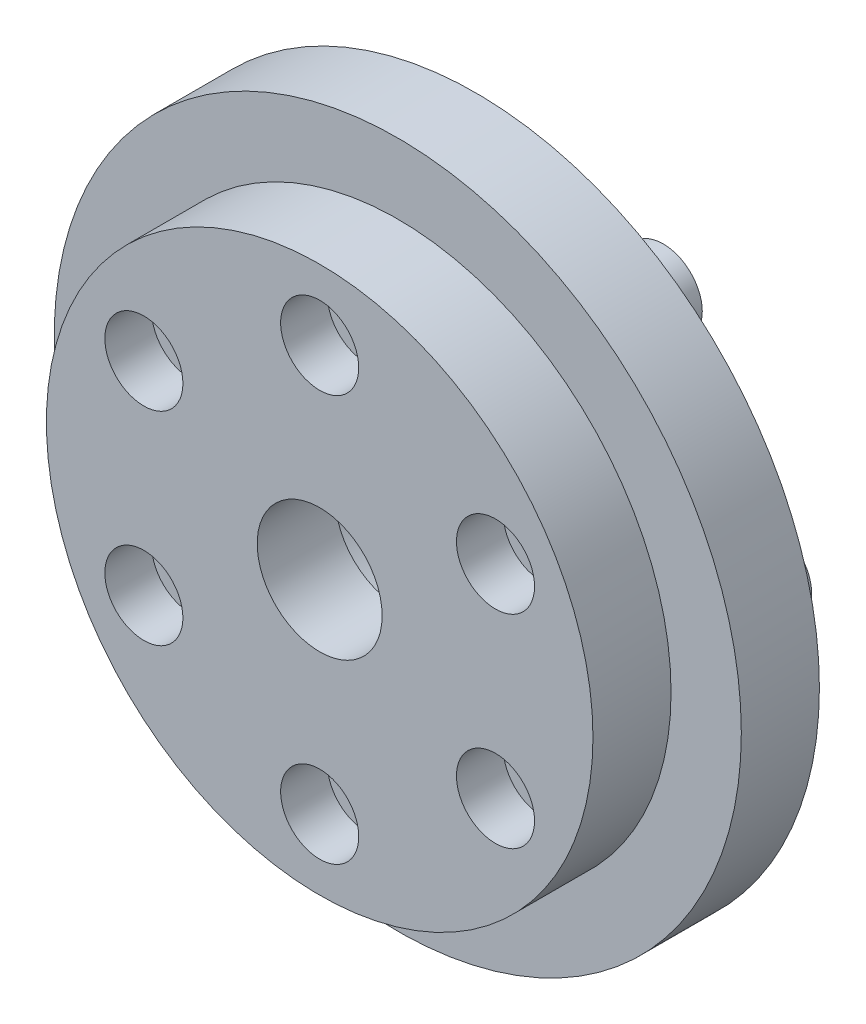
ISO-10303-21;
HEADER;
FILE_DESCRIPTION(('STEP AP214'),'2;1');
FILE_NAME('part.step','',(''),(''),'','','');
FILE_SCHEMA(('AUTOMOTIVE_DESIGN { 1 0 10303 214 1 1 1 1 }'));
ENDSEC;
DATA;
#1=APPLICATION_CONTEXT('core data for automotive mechanical design processes');
#2=APPLICATION_PROTOCOL_DEFINITION('international standard','automotive_design',2000,#1);
#3=PRODUCT_CONTEXT('',#1,'mechanical');
#4=PRODUCT('Part','Part','',(#3));
#5=PRODUCT_RELATED_PRODUCT_CATEGORY('part','',(#4));
#6=PRODUCT_DEFINITION_FORMATION('','',#4);
#7=PRODUCT_DEFINITION_CONTEXT('part definition',#1,'design');
#8=PRODUCT_DEFINITION('design','',#6,#7);
#9=PRODUCT_DEFINITION_SHAPE('','',#8);
#10=(LENGTH_UNIT() NAMED_UNIT(*) SI_UNIT(.MILLI.,.METRE.));
#11=(NAMED_UNIT(*) PLANE_ANGLE_UNIT() SI_UNIT($,.RADIAN.));
#12=(NAMED_UNIT(*) SI_UNIT($,.STERADIAN.) SOLID_ANGLE_UNIT());
#13=UNCERTAINTY_MEASURE_WITH_UNIT(LENGTH_MEASURE(1.E-05),#10,'distance_accuracy_value','');
#14=(GEOMETRIC_REPRESENTATION_CONTEXT(3) GLOBAL_UNCERTAINTY_ASSIGNED_CONTEXT((#13)) GLOBAL_UNIT_ASSIGNED_CONTEXT((#10,
#11,#12)) REPRESENTATION_CONTEXT('',''));
#15=CARTESIAN_POINT('',(0.,0.,0.));
#16=DIRECTION('',(0.,0.,1.));
#17=DIRECTION('',(1.,0.,0.));
#18=AXIS2_PLACEMENT_3D('',#15,#16,#17);
#19=CARTESIAN_POINT('',(0.,0.,-17.6274169979695));
#20=DIRECTION('',(0.,0.,1.));
#21=DIRECTION('',(1.,0.,0.));
#22=AXIS2_PLACEMENT_3D('',#19,#20,#21);
#23=CYLINDRICAL_SURFACE('',#22,8.);
#24=CARTESIAN_POINT('',(0.,0.,5.));
#25=DIRECTION('',(0.,0.,1.));
#26=DIRECTION('',(1.,0.,0.));
#27=AXIS2_PLACEMENT_3D('',#24,#25,#26);
#28=CIRCLE('',#27,8.);
#29=CARTESIAN_POINT('',(8.,0.,5.));
#30=VERTEX_POINT('',#29);
#31=EDGE_CURVE('E510',#30,#30,#28,.F.);
#32=ORIENTED_EDGE('',*,*,#31,.T.);
#33=EDGE_LOOP('',(#32));
#34=FACE_BOUND('',#33,.T.);
#35=CARTESIAN_POINT('',(0.,0.,10.));
#36=DIRECTION('',(0.,0.,1.));
#37=DIRECTION('',(1.,0.,0.));
#38=AXIS2_PLACEMENT_3D('',#35,#36,#37);
#39=CIRCLE('',#38,8.);
#40=CARTESIAN_POINT('',(8.,0.,10.));
#41=VERTEX_POINT('',#40);
#42=EDGE_CURVE('E10',#41,#41,#39,.F.);
#43=ORIENTED_EDGE('',*,*,#42,.F.);
#44=EDGE_LOOP('',(#43));
#45=FACE_BOUND('',#44,.T.);
#46=ADVANCED_FACE('F35',(#34,#45),#23,.F.);
#47=CARTESIAN_POINT('',(-7.,12.1243556529821,5.));
#48=DIRECTION('',(0.,0.,-1.));
#49=DIRECTION('',(-1.,0.,0.));
#50=AXIS2_PLACEMENT_3D('',#47,#48,#49);
#51=CYLINDRICAL_SURFACE('',#50,2.5);
#52=CARTESIAN_POINT('',(-7.,12.1243556529821,5.));
#53=DIRECTION('',(0.,0.,1.));
#54=DIRECTION('',(1.,0.,0.));
#55=AXIS2_PLACEMENT_3D('',#52,#53,#54);
#56=CIRCLE('',#55,2.5);
#57=CARTESIAN_POINT('',(-4.5,12.1243556529821,5.));
#58=VERTEX_POINT('',#57);
#59=EDGE_CURVE('E78',#58,#58,#56,.T.);
#60=ORIENTED_EDGE('',*,*,#59,.F.);
#61=EDGE_LOOP('',(#60));
#62=FACE_BOUND('',#61,.T.);
#63=CARTESIAN_POINT('',(-7.,12.1243556529821,0.));
#64=DIRECTION('',(0.,0.,1.));
#65=DIRECTION('',(1.,0.,0.));
#66=AXIS2_PLACEMENT_3D('',#63,#64,#65);
#67=CIRCLE('',#66,2.5);
#68=CARTESIAN_POINT('',(-4.5,12.1243556529821,0.));
#69=VERTEX_POINT('',#68);
#70=EDGE_CURVE('E75',#69,#69,#67,.T.);
#71=ORIENTED_EDGE('',*,*,#70,.T.);
#72=EDGE_LOOP('',(#71));
#73=FACE_BOUND('',#72,.T.);
#74=ADVANCED_FACE('F37',(#62,#73),#51,.T.);
#75=CARTESIAN_POINT('',(-7.,12.1243556529821,0.));
#76=DIRECTION('',(0.,0.,1.));
#77=DIRECTION('',(1.,0.,0.));
#78=AXIS2_PLACEMENT_3D('',#75,#76,#77);
#79=PLANE('',#78);
#80=ORIENTED_EDGE('',*,*,#70,.F.);
#81=EDGE_LOOP('',(#80));
#82=FACE_BOUND('',#81,.T.);
#83=ADVANCED_FACE('F117',(#82),#79,.F.);
#84=CARTESIAN_POINT('',(0.,0.,10.));
#85=DIRECTION('',(0.,0.,-1.));
#86=DIRECTION('',(-1.,0.,0.));
#87=AXIS2_PLACEMENT_3D('',#84,#85,#86);
#88=CYLINDRICAL_SURFACE('',#87,22.);
#89=CARTESIAN_POINT('',(0.,0.,10.));
#90=DIRECTION('',(0.,0.,1.));
#91=DIRECTION('',(1.,0.,0.));
#92=AXIS2_PLACEMENT_3D('',#89,#90,#91);
#93=CIRCLE('',#92,22.);
#94=CARTESIAN_POINT('',(22.,0.,10.));
#95=VERTEX_POINT('',#94);
#96=EDGE_CURVE('E72',#95,#95,#93,.T.);
#97=ORIENTED_EDGE('',*,*,#96,.F.);
#98=EDGE_LOOP('',(#97));
#99=FACE_BOUND('',#98,.T.);
#100=CARTESIAN_POINT('',(0.,0.,5.));
#101=DIRECTION('',(0.,0.,1.));
#102=DIRECTION('',(1.,0.,0.));
#103=AXIS2_PLACEMENT_3D('',#100,#101,#102);
#104=CIRCLE('',#103,22.);
#105=CARTESIAN_POINT('',(22.,0.,5.));
#106=VERTEX_POINT('',#105);
#107=EDGE_CURVE('E71',#106,#106,#104,.T.);
#108=ORIENTED_EDGE('',*,*,#107,.T.);
#109=EDGE_LOOP('',(#108));
#110=FACE_BOUND('',#109,.T.);
#111=ADVANCED_FACE('F115',(#99,#110),#88,.T.);
#112=CARTESIAN_POINT('',(0.,0.,10.));
#113=DIRECTION('',(0.,0.,1.));
#114=DIRECTION('',(1.,0.,0.));
#115=AXIS2_PLACEMENT_3D('',#112,#113,#114);
#116=PLANE('',#115);
#117=CARTESIAN_POINT('',(0.,0.,10.));
#118=DIRECTION('',(0.,0.,1.));
#119=DIRECTION('',(1.,0.,0.));
#120=AXIS2_PLACEMENT_3D('',#117,#118,#119);
#121=CIRCLE('',#120,17.5);
#122=CARTESIAN_POINT('',(17.5,0.,10.));
#123=VERTEX_POINT('',#122);
#124=EDGE_CURVE('E42',#123,#123,#121,.T.);
#125=ORIENTED_EDGE('',*,*,#124,.F.);
#126=EDGE_LOOP('',(#125));
#127=FACE_BOUND('',#126,.T.);
#128=ORIENTED_EDGE('',*,*,#96,.T.);
#129=EDGE_LOOP('',(#128));
#130=FACE_BOUND('',#129,.T.);
#131=ADVANCED_FACE('F102',(#127,#130),#116,.T.);
#132=CARTESIAN_POINT('',(0.,0.,5.));
#133=DIRECTION('',(0.,0.,1.));
#134=DIRECTION('',(1.,0.,0.));
#135=AXIS2_PLACEMENT_3D('',#132,#133,#134);
#136=PLANE('',#135);
#137=ORIENTED_EDGE('',*,*,#31,.F.);
#138=EDGE_LOOP('',(#137));
#139=FACE_BOUND('',#138,.T.);
#140=CARTESIAN_POINT('',(-14.,1.6826817716975E-13,5.));
#141=DIRECTION('',(0.,0.,1.));
#142=DIRECTION('',(1.,0.,0.));
#143=AXIS2_PLACEMENT_3D('',#140,#141,#142);
#144=CIRCLE('',#143,2.5);
#145=CARTESIAN_POINT('',(-11.5,1.6826817716975E-13,5.));
#146=VERTEX_POINT('',#145);
#147=EDGE_CURVE('E46',#146,#146,#144,.F.);
#148=ORIENTED_EDGE('',*,*,#147,.F.);
#149=EDGE_LOOP('',(#148));
#150=FACE_BOUND('',#149,.T.);
#151=CARTESIAN_POINT('',(-7.00000000000011,-12.1243556529821,5.));
#152=DIRECTION('',(0.,0.,1.));
#153=DIRECTION('',(1.,0.,0.));
#154=AXIS2_PLACEMENT_3D('',#151,#152,#153);
#155=CIRCLE('',#154,2.5);
#156=CARTESIAN_POINT('',(-4.50000000000011,-12.1243556529821,5.));
#157=VERTEX_POINT('',#156);
#158=EDGE_CURVE('E51',#157,#157,#155,.F.);
#159=ORIENTED_EDGE('',*,*,#158,.F.);
#160=EDGE_LOOP('',(#159));
#161=FACE_BOUND('',#160,.T.);
#162=CARTESIAN_POINT('',(6.99999999999991,-12.1243556529822,5.));
#163=DIRECTION('',(0.,0.,1.));
#164=DIRECTION('',(1.,0.,0.));
#165=AXIS2_PLACEMENT_3D('',#162,#163,#164);
#166=CIRCLE('',#165,2.5);
#167=CARTESIAN_POINT('',(9.49999999999991,-12.1243556529822,5.));
#168=VERTEX_POINT('',#167);
#169=EDGE_CURVE('E89',#168,#168,#166,.F.);
#170=ORIENTED_EDGE('',*,*,#169,.F.);
#171=EDGE_LOOP('',(#170));
#172=FACE_BOUND('',#171,.T.);
#173=CARTESIAN_POINT('',(14.,0.,5.));
#174=DIRECTION('',(0.,0.,1.));
#175=DIRECTION('',(1.,0.,0.));
#176=AXIS2_PLACEMENT_3D('',#173,#174,#175);
#177=CIRCLE('',#176,2.5);
#178=CARTESIAN_POINT('',(16.5,0.,5.));
#179=VERTEX_POINT('',#178);
#180=EDGE_CURVE('E86',#179,#179,#177,.F.);
#181=ORIENTED_EDGE('',*,*,#180,.F.);
#182=EDGE_LOOP('',(#181));
#183=FACE_BOUND('',#182,.T.);
#184=CARTESIAN_POINT('',(7.00000000000003,12.1243556529821,5.));
#185=DIRECTION('',(0.,0.,1.));
#186=DIRECTION('',(1.,0.,0.));
#187=AXIS2_PLACEMENT_3D('',#184,#185,#186);
#188=CIRCLE('',#187,2.5);
#189=CARTESIAN_POINT('',(9.50000000000003,12.1243556529821,5.));
#190=VERTEX_POINT('',#189);
#191=EDGE_CURVE('E81',#190,#190,#188,.F.);
#192=ORIENTED_EDGE('',*,*,#191,.F.);
#193=EDGE_LOOP('',(#192));
#194=FACE_BOUND('',#193,.T.);
#195=ORIENTED_EDGE('',*,*,#59,.T.);
#196=EDGE_LOOP('',(#195));
#197=FACE_BOUND('',#196,.T.);
#198=ORIENTED_EDGE('',*,*,#107,.F.);
#199=EDGE_LOOP('',(#198));
#200=FACE_BOUND('',#199,.T.);
#201=ADVANCED_FACE('F98',(#139,#150,#161,#172,#183,#194,#197,#200),#136,.F.);
#202=CARTESIAN_POINT('',(7.00000000000003,12.1243556529821,5.));
#203=DIRECTION('',(0.,0.,-1.));
#204=DIRECTION('',(-1.,0.,0.));
#205=AXIS2_PLACEMENT_3D('',#202,#203,#204);
#206=CYLINDRICAL_SURFACE('',#205,2.5);
#207=ORIENTED_EDGE('',*,*,#191,.T.);
#208=EDGE_LOOP('',(#207));
#209=FACE_BOUND('',#208,.T.);
#210=CARTESIAN_POINT('',(7.00000000000003,12.1243556529821,0.));
#211=DIRECTION('',(0.,0.,1.));
#212=DIRECTION('',(1.,0.,0.));
#213=AXIS2_PLACEMENT_3D('',#210,#211,#212);
#214=CIRCLE('',#213,2.5);
#215=CARTESIAN_POINT('',(9.50000000000003,12.1243556529821,0.));
#216=VERTEX_POINT('',#215);
#217=EDGE_CURVE('E68',#216,#216,#214,.T.);
#218=ORIENTED_EDGE('',*,*,#217,.T.);
#219=EDGE_LOOP('',(#218));
#220=FACE_BOUND('',#219,.T.);
#221=ADVANCED_FACE('F101',(#209,#220),#206,.T.);
#222=CARTESIAN_POINT('',(7.00000000000003,12.1243556529821,0.));
#223=DIRECTION('',(0.,0.,1.));
#224=DIRECTION('',(1.,0.,0.));
#225=AXIS2_PLACEMENT_3D('',#222,#223,#224);
#226=PLANE('',#225);
#227=ORIENTED_EDGE('',*,*,#217,.F.);
#228=EDGE_LOOP('',(#227));
#229=FACE_BOUND('',#228,.T.);
#230=ADVANCED_FACE('F176',(#229),#226,.F.);
#231=CARTESIAN_POINT('',(14.,0.,5.));
#232=DIRECTION('',(0.,0.,-1.));
#233=DIRECTION('',(-1.,0.,0.));
#234=AXIS2_PLACEMENT_3D('',#231,#232,#233);
#235=CYLINDRICAL_SURFACE('',#234,2.5);
#236=ORIENTED_EDGE('',*,*,#180,.T.);
#237=EDGE_LOOP('',(#236));
#238=FACE_BOUND('',#237,.T.);
#239=CARTESIAN_POINT('',(14.,0.,0.));
#240=DIRECTION('',(0.,0.,1.));
#241=DIRECTION('',(1.,0.,0.));
#242=AXIS2_PLACEMENT_3D('',#239,#240,#241);
#243=CIRCLE('',#242,2.5);
#244=CARTESIAN_POINT('',(16.5,0.,0.));
#245=VERTEX_POINT('',#244);
#246=EDGE_CURVE('E65',#245,#245,#243,.T.);
#247=ORIENTED_EDGE('',*,*,#246,.T.);
#248=EDGE_LOOP('',(#247));
#249=FACE_BOUND('',#248,.T.);
#250=ADVANCED_FACE('F173',(#238,#249),#235,.T.);
#251=CARTESIAN_POINT('',(14.,0.,0.));
#252=DIRECTION('',(0.,0.,1.));
#253=DIRECTION('',(1.,0.,0.));
#254=AXIS2_PLACEMENT_3D('',#251,#252,#253);
#255=PLANE('',#254);
#256=ORIENTED_EDGE('',*,*,#246,.F.);
#257=EDGE_LOOP('',(#256));
#258=FACE_BOUND('',#257,.T.);
#259=ADVANCED_FACE('F168',(#258),#255,.F.);
#260=CARTESIAN_POINT('',(6.99999999999991,-12.1243556529822,5.));
#261=DIRECTION('',(0.,0.,-1.));
#262=DIRECTION('',(-1.,0.,0.));
#263=AXIS2_PLACEMENT_3D('',#260,#261,#262);
#264=CYLINDRICAL_SURFACE('',#263,2.5);
#265=ORIENTED_EDGE('',*,*,#169,.T.);
#266=EDGE_LOOP('',(#265));
#267=FACE_BOUND('',#266,.T.);
#268=CARTESIAN_POINT('',(6.99999999999991,-12.1243556529822,0.));
#269=DIRECTION('',(0.,0.,1.));
#270=DIRECTION('',(1.,0.,0.));
#271=AXIS2_PLACEMENT_3D('',#268,#269,#270);
#272=CIRCLE('',#271,2.5);
#273=CARTESIAN_POINT('',(9.49999999999991,-12.1243556529822,0.));
#274=VERTEX_POINT('',#273);
#275=EDGE_CURVE('E62',#274,#274,#272,.T.);
#276=ORIENTED_EDGE('',*,*,#275,.T.);
#277=EDGE_LOOP('',(#276));
#278=FACE_BOUND('',#277,.T.);
#279=ADVANCED_FACE('F165',(#267,#278),#264,.T.);
#280=CARTESIAN_POINT('',(6.99999999999991,-12.1243556529822,0.));
#281=DIRECTION('',(0.,0.,1.));
#282=DIRECTION('',(1.,0.,0.));
#283=AXIS2_PLACEMENT_3D('',#280,#281,#282);
#284=PLANE('',#283);
#285=ORIENTED_EDGE('',*,*,#275,.F.);
#286=EDGE_LOOP('',(#285));
#287=FACE_BOUND('',#286,.T.);
#288=ADVANCED_FACE('F161',(#287),#284,.F.);
#289=CARTESIAN_POINT('',(-7.00000000000011,-12.1243556529821,5.));
#290=DIRECTION('',(0.,0.,-1.));
#291=DIRECTION('',(-1.,0.,0.));
#292=AXIS2_PLACEMENT_3D('',#289,#290,#291);
#293=CYLINDRICAL_SURFACE('',#292,2.5);
#294=ORIENTED_EDGE('',*,*,#158,.T.);
#295=EDGE_LOOP('',(#294));
#296=FACE_BOUND('',#295,.T.);
#297=CARTESIAN_POINT('',(-7.00000000000011,-12.1243556529821,0.));
#298=DIRECTION('',(0.,0.,1.));
#299=DIRECTION('',(1.,0.,0.));
#300=AXIS2_PLACEMENT_3D('',#297,#298,#299);
#301=CIRCLE('',#300,2.5);
#302=CARTESIAN_POINT('',(-4.50000000000011,-12.1243556529821,0.));
#303=VERTEX_POINT('',#302);
#304=EDGE_CURVE('E59',#303,#303,#301,.T.);
#305=ORIENTED_EDGE('',*,*,#304,.T.);
#306=EDGE_LOOP('',(#305));
#307=FACE_BOUND('',#306,.T.);
#308=ADVANCED_FACE('F95',(#296,#307),#293,.T.);
#309=CARTESIAN_POINT('',(-7.00000000000011,-12.1243556529821,0.));
#310=DIRECTION('',(0.,0.,1.));
#311=DIRECTION('',(1.,0.,0.));
#312=AXIS2_PLACEMENT_3D('',#309,#310,#311);
#313=PLANE('',#312);
#314=ORIENTED_EDGE('',*,*,#304,.F.);
#315=EDGE_LOOP('',(#314));
#316=FACE_BOUND('',#315,.T.);
#317=ADVANCED_FACE('F154',(#316),#313,.F.);
#318=CARTESIAN_POINT('',(-14.,1.6826817716975E-13,5.));
#319=DIRECTION('',(0.,0.,-1.));
#320=DIRECTION('',(-1.,0.,0.));
#321=AXIS2_PLACEMENT_3D('',#318,#319,#320);
#322=CYLINDRICAL_SURFACE('',#321,2.5);
#323=ORIENTED_EDGE('',*,*,#147,.T.);
#324=EDGE_LOOP('',(#323));
#325=FACE_BOUND('',#324,.T.);
#326=CARTESIAN_POINT('',(-14.,1.6826817716975E-13,0.));
#327=DIRECTION('',(0.,0.,1.));
#328=DIRECTION('',(1.,0.,0.));
#329=AXIS2_PLACEMENT_3D('',#326,#327,#328);
#330=CIRCLE('',#329,2.5);
#331=CARTESIAN_POINT('',(-11.5,1.6826817716975E-13,0.));
#332=VERTEX_POINT('',#331);
#333=EDGE_CURVE('E56',#332,#332,#330,.T.);
#334=ORIENTED_EDGE('',*,*,#333,.T.);
#335=EDGE_LOOP('',(#334));
#336=FACE_BOUND('',#335,.T.);
#337=ADVANCED_FACE('F151',(#325,#336),#322,.T.);
#338=CARTESIAN_POINT('',(-14.,1.6826817716975E-13,0.));
#339=DIRECTION('',(0.,0.,1.));
#340=DIRECTION('',(1.,0.,0.));
#341=AXIS2_PLACEMENT_3D('',#338,#339,#340);
#342=PLANE('',#341);
#343=ORIENTED_EDGE('',*,*,#333,.F.);
#344=EDGE_LOOP('',(#343));
#345=FACE_BOUND('',#344,.T.);
#346=ADVANCED_FACE('F149',(#345),#342,.F.);
#347=CARTESIAN_POINT('',(0.,0.,15.));
#348=DIRECTION('',(0.,0.,-1.));
#349=DIRECTION('',(-1.,0.,0.));
#350=AXIS2_PLACEMENT_3D('',#347,#348,#349);
#351=CYLINDRICAL_SURFACE('',#350,17.5);
#352=CARTESIAN_POINT('',(0.,0.,15.));
#353=DIRECTION('',(0.,0.,1.));
#354=DIRECTION('',(1.,0.,0.));
#355=AXIS2_PLACEMENT_3D('',#352,#353,#354);
#356=CIRCLE('',#355,17.5);
#357=CARTESIAN_POINT('',(17.5,0.,15.));
#358=VERTEX_POINT('',#357);
#359=EDGE_CURVE('E54',#358,#358,#356,.T.);
#360=ORIENTED_EDGE('',*,*,#359,.F.);
#361=EDGE_LOOP('',(#360));
#362=FACE_BOUND('',#361,.T.);
#363=ORIENTED_EDGE('',*,*,#124,.T.);
#364=EDGE_LOOP('',(#363));
#365=FACE_BOUND('',#364,.T.);
#366=ADVANCED_FACE('F145',(#362,#365),#351,.T.);
#367=CARTESIAN_POINT('',(0.,0.,15.));
#368=DIRECTION('',(0.,0.,1.));
#369=DIRECTION('',(1.,0.,0.));
#370=AXIS2_PLACEMENT_3D('',#367,#368,#369);
#371=PLANE('',#370);
#372=CARTESIAN_POINT('',(0.,13.,15.));
#373=DIRECTION('',(0.,0.,1.));
#374=DIRECTION('',(1.,0.,0.));
#375=AXIS2_PLACEMENT_3D('',#372,#373,#374);
#376=CIRCLE('',#375,2.5);
#377=CARTESIAN_POINT('',(2.5,13.,15.));
#378=VERTEX_POINT('',#377);
#379=EDGE_CURVE('E511',#378,#378,#376,.T.);
#380=ORIENTED_EDGE('',*,*,#379,.F.);
#381=EDGE_LOOP('',(#380));
#382=FACE_BOUND('',#381,.T.);
#383=CARTESIAN_POINT('',(-11.2583302491976,6.50000000000013,15.));
#384=DIRECTION('',(0.,0.,1.));
#385=DIRECTION('',(1.,0.,0.));
#386=AXIS2_PLACEMENT_3D('',#383,#384,#385);
#387=CIRCLE('',#386,2.5);
#388=CARTESIAN_POINT('',(-8.75833024919763,6.50000000000013,15.));
#389=VERTEX_POINT('',#388);
#390=EDGE_CURVE('E515',#389,#389,#387,.T.);
#391=ORIENTED_EDGE('',*,*,#390,.F.);
#392=EDGE_LOOP('',(#391));
#393=FACE_BOUND('',#392,.T.);
#394=CARTESIAN_POINT('',(-11.2583302491978,-6.4999999999999,15.));
#395=DIRECTION('',(0.,0.,1.));
#396=DIRECTION('',(1.,0.,0.));
#397=AXIS2_PLACEMENT_3D('',#394,#395,#396);
#398=CIRCLE('',#397,2.5);
#399=CARTESIAN_POINT('',(-8.75833024919776,-6.4999999999999,15.));
#400=VERTEX_POINT('',#399);
#401=EDGE_CURVE('E538',#400,#400,#398,.T.);
#402=ORIENTED_EDGE('',*,*,#401,.F.);
#403=EDGE_LOOP('',(#402));
#404=FACE_BOUND('',#403,.T.);
#405=CARTESIAN_POINT('',(0.,-13.,15.));
#406=DIRECTION('',(0.,0.,1.));
#407=DIRECTION('',(1.,0.,0.));
#408=AXIS2_PLACEMENT_3D('',#405,#406,#407);
#409=CIRCLE('',#408,2.5);
#410=CARTESIAN_POINT('',(2.49999999999991,-13.,15.));
#411=VERTEX_POINT('',#410);
#412=EDGE_CURVE('E532',#411,#411,#409,.T.);
#413=ORIENTED_EDGE('',*,*,#412,.F.);
#414=EDGE_LOOP('',(#413));
#415=FACE_BOUND('',#414,.T.);
#416=CARTESIAN_POINT('',(11.2583302491977,-6.50000000000005,15.));
#417=DIRECTION('',(0.,0.,1.));
#418=DIRECTION('',(1.,0.,0.));
#419=AXIS2_PLACEMENT_3D('',#416,#417,#418);
#420=CIRCLE('',#419,2.5);
#421=CARTESIAN_POINT('',(13.7583302491977,-6.50000000000005,15.));
#422=VERTEX_POINT('',#421);
#423=EDGE_CURVE('E526',#422,#422,#420,.T.);
#424=ORIENTED_EDGE('',*,*,#423,.F.);
#425=EDGE_LOOP('',(#424));
#426=FACE_BOUND('',#425,.T.);
#427=CARTESIAN_POINT('',(11.2583302491977,6.49999999999997,15.));
#428=DIRECTION('',(0.,0.,1.));
#429=DIRECTION('',(1.,0.,0.));
#430=AXIS2_PLACEMENT_3D('',#427,#428,#429);
#431=CIRCLE('',#430,2.5);
#432=CARTESIAN_POINT('',(13.7583302491977,6.49999999999997,15.));
#433=VERTEX_POINT('',#432);
#434=EDGE_CURVE('E514',#433,#433,#431,.T.);
#435=ORIENTED_EDGE('',*,*,#434,.F.);
#436=EDGE_LOOP('',(#435));
#437=FACE_BOUND('',#436,.T.);
#438=ORIENTED_EDGE('',*,*,#359,.T.);
#439=EDGE_LOOP('',(#438));
#440=FACE_BOUND('',#439,.T.);
#441=CARTESIAN_POINT('',(0.,0.,15.));
#442=DIRECTION('',(0.,0.,1.));
#443=DIRECTION('',(1.,0.,0.));
#444=AXIS2_PLACEMENT_3D('',#441,#442,#443);
#445=CIRCLE('',#444,4.);
#446=CARTESIAN_POINT('',(4.,0.,15.));
#447=VERTEX_POINT('',#446);
#448=EDGE_CURVE('E501',#447,#447,#445,.T.);
#449=ORIENTED_EDGE('',*,*,#448,.F.);
#450=EDGE_LOOP('',(#449));
#451=FACE_BOUND('',#450,.T.);
#452=ADVANCED_FACE('F141',(#382,#393,#404,#415,#426,#437,#440,#451),#371,.T.);
#453=CARTESIAN_POINT('',(11.2583302491977,6.49999999999997,12.));
#454=DIRECTION('',(0.,0.,1.));
#455=DIRECTION('',(1.,0.,0.));
#456=AXIS2_PLACEMENT_3D('',#453,#454,#455);
#457=CYLINDRICAL_SURFACE('',#456,2.5);
#458=CARTESIAN_POINT('',(11.2583302491977,6.49999999999997,12.));
#459=DIRECTION('',(0.,0.,1.));
#460=DIRECTION('',(1.,0.,0.));
#461=AXIS2_PLACEMENT_3D('',#458,#459,#460);
#462=CIRCLE('',#461,2.5);
#463=CARTESIAN_POINT('',(13.7583302491977,6.49999999999997,12.));
#464=VERTEX_POINT('',#463);
#465=EDGE_CURVE('E523',#464,#464,#462,.T.);
#466=ORIENTED_EDGE('',*,*,#465,.F.);
#467=EDGE_LOOP('',(#466));
#468=FACE_BOUND('',#467,.T.);
#469=ORIENTED_EDGE('',*,*,#434,.T.);
#470=EDGE_LOOP('',(#469));
#471=FACE_BOUND('',#470,.T.);
#472=ADVANCED_FACE('F144',(#468,#471),#457,.F.);
#473=CARTESIAN_POINT('',(11.2583302491977,6.49999999999997,12.));
#474=DIRECTION('',(0.,0.,1.));
#475=DIRECTION('',(1.,0.,0.));
#476=AXIS2_PLACEMENT_3D('',#473,#474,#475);
#477=PLANE('',#476);
#478=ORIENTED_EDGE('',*,*,#465,.T.);
#479=EDGE_LOOP('',(#478));
#480=FACE_BOUND('',#479,.T.);
#481=ADVANCED_FACE('F241',(#480),#477,.T.);
#482=CARTESIAN_POINT('',(11.2583302491977,-6.50000000000005,12.));
#483=DIRECTION('',(0.,0.,1.));
#484=DIRECTION('',(1.,0.,0.));
#485=AXIS2_PLACEMENT_3D('',#482,#483,#484);
#486=CYLINDRICAL_SURFACE('',#485,2.5);
#487=CARTESIAN_POINT('',(11.2583302491977,-6.50000000000005,12.));
#488=DIRECTION('',(0.,0.,1.));
#489=DIRECTION('',(1.,0.,0.));
#490=AXIS2_PLACEMENT_3D('',#487,#488,#489);
#491=CIRCLE('',#490,2.5);
#492=CARTESIAN_POINT('',(13.7583302491977,-6.50000000000005,12.));
#493=VERTEX_POINT('',#492);
#494=EDGE_CURVE('E529',#493,#493,#491,.T.);
#495=ORIENTED_EDGE('',*,*,#494,.F.);
#496=EDGE_LOOP('',(#495));
#497=FACE_BOUND('',#496,.T.);
#498=ORIENTED_EDGE('',*,*,#423,.T.);
#499=EDGE_LOOP('',(#498));
#500=FACE_BOUND('',#499,.T.);
#501=ADVANCED_FACE('F249',(#497,#500),#486,.F.);
#502=CARTESIAN_POINT('',(11.2583302491977,-6.50000000000005,12.));
#503=DIRECTION('',(0.,0.,1.));
#504=DIRECTION('',(1.,0.,0.));
#505=AXIS2_PLACEMENT_3D('',#502,#503,#504);
#506=PLANE('',#505);
#507=ORIENTED_EDGE('',*,*,#494,.T.);
#508=EDGE_LOOP('',(#507));
#509=FACE_BOUND('',#508,.T.);
#510=ADVANCED_FACE('F257',(#509),#506,.T.);
#511=CARTESIAN_POINT('',(0.,-13.,12.));
#512=DIRECTION('',(0.,0.,1.));
#513=DIRECTION('',(1.,0.,0.));
#514=AXIS2_PLACEMENT_3D('',#511,#512,#513);
#515=CYLINDRICAL_SURFACE('',#514,2.5);
#516=CARTESIAN_POINT('',(0.,-13.,12.));
#517=DIRECTION('',(0.,0.,1.));
#518=DIRECTION('',(1.,0.,0.));
#519=AXIS2_PLACEMENT_3D('',#516,#517,#518);
#520=CIRCLE('',#519,2.5);
#521=CARTESIAN_POINT('',(2.49999999999991,-13.,12.));
#522=VERTEX_POINT('',#521);
#523=EDGE_CURVE('E535',#522,#522,#520,.T.);
#524=ORIENTED_EDGE('',*,*,#523,.F.);
#525=EDGE_LOOP('',(#524));
#526=FACE_BOUND('',#525,.T.);
#527=ORIENTED_EDGE('',*,*,#412,.T.);
#528=EDGE_LOOP('',(#527));
#529=FACE_BOUND('',#528,.T.);
#530=ADVANCED_FACE('F265',(#526,#529),#515,.F.);
#531=CARTESIAN_POINT('',(0.,-13.,12.));
#532=DIRECTION('',(0.,0.,1.));
#533=DIRECTION('',(1.,0.,0.));
#534=AXIS2_PLACEMENT_3D('',#531,#532,#533);
#535=PLANE('',#534);
#536=ORIENTED_EDGE('',*,*,#523,.T.);
#537=EDGE_LOOP('',(#536));
#538=FACE_BOUND('',#537,.T.);
#539=ADVANCED_FACE('F273',(#538),#535,.T.);
#540=CARTESIAN_POINT('',(-11.2583302491978,-6.4999999999999,12.));
#541=DIRECTION('',(0.,0.,1.));
#542=DIRECTION('',(1.,0.,0.));
#543=AXIS2_PLACEMENT_3D('',#540,#541,#542);
#544=CYLINDRICAL_SURFACE('',#543,2.5);
#545=CARTESIAN_POINT('',(-11.2583302491978,-6.4999999999999,12.));
#546=DIRECTION('',(0.,0.,1.));
#547=DIRECTION('',(1.,0.,0.));
#548=AXIS2_PLACEMENT_3D('',#545,#546,#547);
#549=CIRCLE('',#548,2.5);
#550=CARTESIAN_POINT('',(-8.75833024919776,-6.4999999999999,12.));
#551=VERTEX_POINT('',#550);
#552=EDGE_CURVE('E518',#551,#551,#549,.T.);
#553=ORIENTED_EDGE('',*,*,#552,.F.);
#554=EDGE_LOOP('',(#553));
#555=FACE_BOUND('',#554,.T.);
#556=ORIENTED_EDGE('',*,*,#401,.T.);
#557=EDGE_LOOP('',(#556));
#558=FACE_BOUND('',#557,.T.);
#559=ADVANCED_FACE('F281',(#555,#558),#544,.F.);
#560=CARTESIAN_POINT('',(-11.2583302491978,-6.4999999999999,12.));
#561=DIRECTION('',(0.,0.,1.));
#562=DIRECTION('',(1.,0.,0.));
#563=AXIS2_PLACEMENT_3D('',#560,#561,#562);
#564=PLANE('',#563);
#565=ORIENTED_EDGE('',*,*,#552,.T.);
#566=EDGE_LOOP('',(#565));
#567=FACE_BOUND('',#566,.T.);
#568=ADVANCED_FACE('F139',(#567),#564,.T.);
#569=CARTESIAN_POINT('',(-11.2583302491976,6.50000000000013,12.));
#570=DIRECTION('',(0.,0.,1.));
#571=DIRECTION('',(1.,0.,0.));
#572=AXIS2_PLACEMENT_3D('',#569,#570,#571);
#573=CYLINDRICAL_SURFACE('',#572,2.5);
#574=CARTESIAN_POINT('',(-11.2583302491976,6.50000000000013,12.));
#575=DIRECTION('',(0.,0.,1.));
#576=DIRECTION('',(1.,0.,0.));
#577=AXIS2_PLACEMENT_3D('',#574,#575,#576);
#578=CIRCLE('',#577,2.5);
#579=CARTESIAN_POINT('',(-8.75833024919763,6.50000000000013,12.));
#580=VERTEX_POINT('',#579);
#581=EDGE_CURVE('E504',#580,#580,#578,.T.);
#582=ORIENTED_EDGE('',*,*,#581,.F.);
#583=EDGE_LOOP('',(#582));
#584=FACE_BOUND('',#583,.T.);
#585=ORIENTED_EDGE('',*,*,#390,.T.);
#586=EDGE_LOOP('',(#585));
#587=FACE_BOUND('',#586,.T.);
#588=ADVANCED_FACE('F295',(#584,#587),#573,.F.);
#589=CARTESIAN_POINT('',(-11.2583302491976,6.50000000000013,12.));
#590=DIRECTION('',(0.,0.,1.));
#591=DIRECTION('',(1.,0.,0.));
#592=AXIS2_PLACEMENT_3D('',#589,#590,#591);
#593=PLANE('',#592);
#594=ORIENTED_EDGE('',*,*,#581,.T.);
#595=EDGE_LOOP('',(#594));
#596=FACE_BOUND('',#595,.T.);
#597=ADVANCED_FACE('F302',(#596),#593,.T.);
#598=CARTESIAN_POINT('',(0.,13.,12.));
#599=DIRECTION('',(0.,0.,1.));
#600=DIRECTION('',(1.,0.,0.));
#601=AXIS2_PLACEMENT_3D('',#598,#599,#600);
#602=CYLINDRICAL_SURFACE('',#601,2.5);
#603=CARTESIAN_POINT('',(0.,13.,12.));
#604=DIRECTION('',(0.,0.,1.));
#605=DIRECTION('',(1.,0.,0.));
#606=AXIS2_PLACEMENT_3D('',#603,#604,#605);
#607=CIRCLE('',#606,2.5);
#608=CARTESIAN_POINT('',(2.5,13.,12.));
#609=VERTEX_POINT('',#608);
#610=EDGE_CURVE('E507',#609,#609,#607,.T.);
#611=ORIENTED_EDGE('',*,*,#610,.F.);
#612=EDGE_LOOP('',(#611));
#613=FACE_BOUND('',#612,.T.);
#614=ORIENTED_EDGE('',*,*,#379,.T.);
#615=EDGE_LOOP('',(#614));
#616=FACE_BOUND('',#615,.T.);
#617=ADVANCED_FACE('F310',(#613,#616),#602,.F.);
#618=CARTESIAN_POINT('',(0.,13.,12.));
#619=DIRECTION('',(0.,0.,1.));
#620=DIRECTION('',(1.,0.,0.));
#621=AXIS2_PLACEMENT_3D('',#618,#619,#620);
#622=PLANE('',#621);
#623=ORIENTED_EDGE('',*,*,#610,.T.);
#624=EDGE_LOOP('',(#623));
#625=FACE_BOUND('',#624,.T.);
#626=ADVANCED_FACE('F318',(#625),#622,.T.);
#627=CARTESIAN_POINT('',(0.,0.,10.));
#628=DIRECTION('',(0.,0.,1.));
#629=DIRECTION('',(1.,0.,0.));
#630=AXIS2_PLACEMENT_3D('',#627,#628,#629);
#631=PLANE('',#630);
#632=CARTESIAN_POINT('',(0.,0.,10.));
#633=DIRECTION('',(0.,0.,1.));
#634=DIRECTION('',(1.,0.,0.));
#635=AXIS2_PLACEMENT_3D('',#632,#633,#634);
#636=CIRCLE('',#635,4.);
#637=CARTESIAN_POINT('',(4.,0.,10.));
#638=VERTEX_POINT('',#637);
#639=EDGE_CURVE('E498',#638,#638,#636,.T.);
#640=ORIENTED_EDGE('',*,*,#639,.T.);
#641=EDGE_LOOP('',(#640));
#642=FACE_BOUND('',#641,.T.);
#643=ORIENTED_EDGE('',*,*,#42,.T.);
#644=EDGE_LOOP('',(#643));
#645=FACE_BOUND('',#644,.T.);
#646=ADVANCED_FACE('F326',(#642,#645),#631,.F.);
#647=CARTESIAN_POINT('',(0.,0.,10.));
#648=DIRECTION('',(0.,0.,1.));
#649=DIRECTION('',(1.,0.,0.));
#650=AXIS2_PLACEMENT_3D('',#647,#648,#649);
#651=CYLINDRICAL_SURFACE('',#650,4.);
#652=ORIENTED_EDGE('',*,*,#639,.F.);
#653=EDGE_LOOP('',(#652));
#654=FACE_BOUND('',#653,.T.);
#655=ORIENTED_EDGE('',*,*,#448,.T.);
#656=EDGE_LOOP('',(#655));
#657=FACE_BOUND('',#656,.T.);
#658=ADVANCED_FACE('F333',(#654,#657),#651,.F.);
#659=CLOSED_SHELL('',(#46,#74,#83,#111,#131,#201,#221,#230,#250,#259,#279,#288,#308,#317,#337,
#346,#366,#452,#472,#481,#501,#510,#530,#539,#559,#568,#588,#597,#617,#626,#646,#658));
#660=MANIFOLD_SOLID_BREP('B2',#659);
#661=ADVANCED_BREP_SHAPE_REPRESENTATION('',(#18,#660),#14);
#662=SHAPE_DEFINITION_REPRESENTATION(#9,#661);
ENDSEC;
END-ISO-10303-21;
